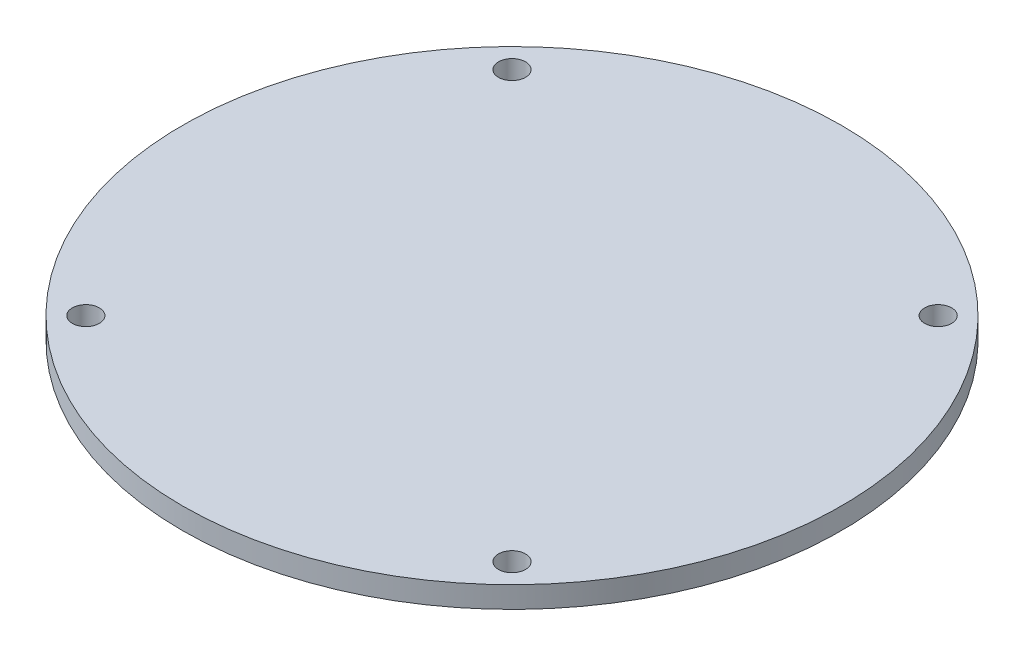
ISO-10303-21;
HEADER;
FILE_DESCRIPTION(('STEP AP214'),'2;1');
FILE_NAME('part.step','',(''),(''),'','','');
FILE_SCHEMA(('AUTOMOTIVE_DESIGN { 1 0 10303 214 1 1 1 1 }'));
ENDSEC;
DATA;
#1=APPLICATION_CONTEXT('core data for automotive mechanical design processes');
#2=APPLICATION_PROTOCOL_DEFINITION('international standard','automotive_design',2000,#1);
#3=PRODUCT_CONTEXT('',#1,'mechanical');
#4=PRODUCT('Part','Part','',(#3));
#5=PRODUCT_RELATED_PRODUCT_CATEGORY('part','',(#4));
#6=PRODUCT_DEFINITION_FORMATION('','',#4);
#7=PRODUCT_DEFINITION_CONTEXT('part definition',#1,'design');
#8=PRODUCT_DEFINITION('design','',#6,#7);
#9=PRODUCT_DEFINITION_SHAPE('','',#8);
#10=(LENGTH_UNIT() NAMED_UNIT(*) SI_UNIT(.MILLI.,.METRE.));
#11=(NAMED_UNIT(*) PLANE_ANGLE_UNIT() SI_UNIT($,.RADIAN.));
#12=(NAMED_UNIT(*) SI_UNIT($,.STERADIAN.) SOLID_ANGLE_UNIT());
#13=UNCERTAINTY_MEASURE_WITH_UNIT(LENGTH_MEASURE(1.E-05),#10,'distance_accuracy_value','');
#14=(GEOMETRIC_REPRESENTATION_CONTEXT(3) GLOBAL_UNCERTAINTY_ASSIGNED_CONTEXT((#13)) GLOBAL_UNIT_ASSIGNED_CONTEXT((#10,
#11,#12)) REPRESENTATION_CONTEXT('',''));
#15=CARTESIAN_POINT('',(0.,0.,0.));
#16=DIRECTION('',(0.,0.,1.));
#17=DIRECTION('',(1.,0.,0.));
#18=AXIS2_PLACEMENT_3D('',#15,#16,#17);
#19=CARTESIAN_POINT('',(16.1644610179254,1.6256,16.1644610179245));
#20=DIRECTION('',(0.,-1.,0.));
#21=DIRECTION('',(0.,0.,-1.));
#22=AXIS2_PLACEMENT_3D('',#19,#20,#21);
#23=CYLINDRICAL_SURFACE('',#22,1.02499999999977);
#24=CARTESIAN_POINT('',(16.1644610179254,1.6256,16.1644610179245));
#25=DIRECTION('',(0.,1.,0.));
#26=DIRECTION('',(0.,0.,1.));
#27=AXIS2_PLACEMENT_3D('',#24,#25,#26);
#28=CIRCLE('',#27,1.02499999999977);
#29=CARTESIAN_POINT('',(16.1644610179254,1.6256,17.1894610179242));
#30=VERTEX_POINT('',#29);
#31=EDGE_CURVE('E41',#30,#30,#28,.T.);
#32=ORIENTED_EDGE('',*,*,#31,.T.);
#33=EDGE_LOOP('',(#32));
#34=FACE_BOUND('',#33,.T.);
#35=CARTESIAN_POINT('',(16.1644610179254,0.,16.1644610179245));
#36=DIRECTION('',(0.,1.,0.));
#37=DIRECTION('',(0.,0.,1.));
#38=AXIS2_PLACEMENT_3D('',#35,#36,#37);
#39=CIRCLE('',#38,1.02499999999977);
#40=CARTESIAN_POINT('',(16.1644610179254,0.,17.1894610179242));
#41=VERTEX_POINT('',#40);
#42=EDGE_CURVE('E58',#41,#41,#39,.T.);
#43=ORIENTED_EDGE('',*,*,#42,.F.);
#44=EDGE_LOOP('',(#43));
#45=FACE_BOUND('',#44,.T.);
#46=ADVANCED_FACE('F33',(#34,#45),#23,.F.);
#47=CARTESIAN_POINT('',(-16.1644610179236,1.6256,16.1644610179254));
#48=DIRECTION('',(0.,-1.,0.));
#49=DIRECTION('',(0.,0.,-1.));
#50=AXIS2_PLACEMENT_3D('',#47,#48,#49);
#51=CYLINDRICAL_SURFACE('',#50,1.02500000000068);
#52=CARTESIAN_POINT('',(-16.1644610179236,1.6256,16.1644610179254));
#53=DIRECTION('',(0.,1.,0.));
#54=DIRECTION('',(0.,0.,1.));
#55=AXIS2_PLACEMENT_3D('',#52,#53,#54);
#56=CIRCLE('',#55,1.02500000000068);
#57=CARTESIAN_POINT('',(-16.1644610179236,1.6256,17.1894610179261));
#58=VERTEX_POINT('',#57);
#59=EDGE_CURVE('E46',#58,#58,#56,.T.);
#60=ORIENTED_EDGE('',*,*,#59,.T.);
#61=EDGE_LOOP('',(#60));
#62=FACE_BOUND('',#61,.T.);
#63=CARTESIAN_POINT('',(-16.1644610179236,0.,16.1644610179254));
#64=DIRECTION('',(0.,1.,0.));
#65=DIRECTION('',(0.,0.,1.));
#66=AXIS2_PLACEMENT_3D('',#63,#64,#65);
#67=CIRCLE('',#66,1.02500000000068);
#68=CARTESIAN_POINT('',(-16.1644610179236,0.,17.1894610179261));
#69=VERTEX_POINT('',#68);
#70=EDGE_CURVE('E56',#69,#69,#67,.T.);
#71=ORIENTED_EDGE('',*,*,#70,.F.);
#72=EDGE_LOOP('',(#71));
#73=FACE_BOUND('',#72,.T.);
#74=ADVANCED_FACE('F76',(#62,#73),#51,.F.);
#75=CARTESIAN_POINT('',(-16.1644610179245,1.6256,-16.1644610179236));
#76=DIRECTION('',(0.,-1.,0.));
#77=DIRECTION('',(0.,0.,-1.));
#78=AXIS2_PLACEMENT_3D('',#75,#76,#77);
#79=CYLINDRICAL_SURFACE('',#78,1.02500000000097);
#80=CARTESIAN_POINT('',(-16.1644610179245,1.6256,-16.1644610179236));
#81=DIRECTION('',(0.,1.,0.));
#82=DIRECTION('',(0.,0.,1.));
#83=AXIS2_PLACEMENT_3D('',#80,#81,#82);
#84=CIRCLE('',#83,1.02500000000097);
#85=CARTESIAN_POINT('',(-16.1644610179245,1.6256,-15.1394610179226));
#86=VERTEX_POINT('',#85);
#87=EDGE_CURVE('E67',#86,#86,#84,.T.);
#88=ORIENTED_EDGE('',*,*,#87,.T.);
#89=EDGE_LOOP('',(#88));
#90=FACE_BOUND('',#89,.T.);
#91=CARTESIAN_POINT('',(-16.1644610179245,0.,-16.1644610179236));
#92=DIRECTION('',(0.,1.,0.));
#93=DIRECTION('',(0.,0.,1.));
#94=AXIS2_PLACEMENT_3D('',#91,#92,#93);
#95=CIRCLE('',#94,1.02500000000097);
#96=CARTESIAN_POINT('',(-16.1644610179245,0.,-15.1394610179226));
#97=VERTEX_POINT('',#96);
#98=EDGE_CURVE('E53',#97,#97,#95,.T.);
#99=ORIENTED_EDGE('',*,*,#98,.F.);
#100=EDGE_LOOP('',(#99));
#101=FACE_BOUND('',#100,.T.);
#102=ADVANCED_FACE('F94',(#90,#101),#79,.F.);
#103=CARTESIAN_POINT('',(16.1644610179245,1.6256,-16.1644610179245));
#104=DIRECTION('',(0.,-1.,0.));
#105=DIRECTION('',(0.,0.,-1.));
#106=AXIS2_PLACEMENT_3D('',#103,#104,#105);
#107=CYLINDRICAL_SURFACE('',#106,1.025);
#108=CARTESIAN_POINT('',(16.1644610179245,1.6256,-16.1644610179245));
#109=DIRECTION('',(0.,1.,0.));
#110=DIRECTION('',(0.,0.,1.));
#111=AXIS2_PLACEMENT_3D('',#108,#109,#110);
#112=CIRCLE('',#111,1.025);
#113=CARTESIAN_POINT('',(16.1644610179245,1.6256,-15.1394610179245));
#114=VERTEX_POINT('',#113);
#115=EDGE_CURVE('E63',#114,#114,#112,.T.);
#116=ORIENTED_EDGE('',*,*,#115,.T.);
#117=EDGE_LOOP('',(#116));
#118=FACE_BOUND('',#117,.T.);
#119=CARTESIAN_POINT('',(16.1644610179245,0.,-16.1644610179245));
#120=DIRECTION('',(0.,1.,0.));
#121=DIRECTION('',(0.,0.,1.));
#122=AXIS2_PLACEMENT_3D('',#119,#120,#121);
#123=CIRCLE('',#122,1.025);
#124=CARTESIAN_POINT('',(16.1644610179245,0.,-15.1394610179245));
#125=VERTEX_POINT('',#124);
#126=EDGE_CURVE('E50',#125,#125,#123,.T.);
#127=ORIENTED_EDGE('',*,*,#126,.F.);
#128=EDGE_LOOP('',(#127));
#129=FACE_BOUND('',#128,.T.);
#130=ADVANCED_FACE('F35',(#118,#129),#107,.F.);
#131=CARTESIAN_POINT('',(0.,1.6256,0.));
#132=DIRECTION('',(0.,-1.,0.));
#133=DIRECTION('',(0.,0.,-1.));
#134=AXIS2_PLACEMENT_3D('',#131,#132,#133);
#135=CYLINDRICAL_SURFACE('',#134,25.);
#136=CARTESIAN_POINT('',(0.,1.6256,0.));
#137=DIRECTION('',(0.,1.,0.));
#138=DIRECTION('',(0.,0.,1.));
#139=AXIS2_PLACEMENT_3D('',#136,#137,#138);
#140=CIRCLE('',#139,25.);
#141=CARTESIAN_POINT('',(0.,1.6256,25.));
#142=VERTEX_POINT('',#141);
#143=EDGE_CURVE('E10',#142,#142,#140,.T.);
#144=ORIENTED_EDGE('',*,*,#143,.F.);
#145=EDGE_LOOP('',(#144));
#146=FACE_BOUND('',#145,.T.);
#147=CARTESIAN_POINT('',(0.,0.,0.));
#148=DIRECTION('',(0.,1.,0.));
#149=DIRECTION('',(0.,0.,1.));
#150=AXIS2_PLACEMENT_3D('',#147,#148,#149);
#151=CIRCLE('',#150,25.);
#152=CARTESIAN_POINT('',(0.,0.,25.));
#153=VERTEX_POINT('',#152);
#154=EDGE_CURVE('E37',#153,#153,#151,.T.);
#155=ORIENTED_EDGE('',*,*,#154,.T.);
#156=EDGE_LOOP('',(#155));
#157=FACE_BOUND('',#156,.T.);
#158=ADVANCED_FACE('F83',(#146,#157),#135,.T.);
#159=CARTESIAN_POINT('',(0.,1.6256,0.));
#160=DIRECTION('',(0.,1.,0.));
#161=DIRECTION('',(0.,0.,1.));
#162=AXIS2_PLACEMENT_3D('',#159,#160,#161);
#163=PLANE('',#162);
#164=ORIENTED_EDGE('',*,*,#115,.F.);
#165=EDGE_LOOP('',(#164));
#166=FACE_BOUND('',#165,.T.);
#167=ORIENTED_EDGE('',*,*,#87,.F.);
#168=EDGE_LOOP('',(#167));
#169=FACE_BOUND('',#168,.T.);
#170=ORIENTED_EDGE('',*,*,#59,.F.);
#171=EDGE_LOOP('',(#170));
#172=FACE_BOUND('',#171,.T.);
#173=ORIENTED_EDGE('',*,*,#31,.F.);
#174=EDGE_LOOP('',(#173));
#175=FACE_BOUND('',#174,.T.);
#176=ORIENTED_EDGE('',*,*,#143,.T.);
#177=EDGE_LOOP('',(#176));
#178=FACE_BOUND('',#177,.T.);
#179=ADVANCED_FACE('F79',(#166,#169,#172,#175,#178),#163,.T.);
#180=CARTESIAN_POINT('',(0.,0.,0.));
#181=DIRECTION('',(0.,1.,0.));
#182=DIRECTION('',(0.,0.,1.));
#183=AXIS2_PLACEMENT_3D('',#180,#181,#182);
#184=PLANE('',#183);
#185=ORIENTED_EDGE('',*,*,#126,.T.);
#186=EDGE_LOOP('',(#185));
#187=FACE_BOUND('',#186,.T.);
#188=ORIENTED_EDGE('',*,*,#98,.T.);
#189=EDGE_LOOP('',(#188));
#190=FACE_BOUND('',#189,.T.);
#191=ORIENTED_EDGE('',*,*,#70,.T.);
#192=EDGE_LOOP('',(#191));
#193=FACE_BOUND('',#192,.T.);
#194=ORIENTED_EDGE('',*,*,#42,.T.);
#195=EDGE_LOOP('',(#194));
#196=FACE_BOUND('',#195,.T.);
#197=ORIENTED_EDGE('',*,*,#154,.F.);
#198=EDGE_LOOP('',(#197));
#199=FACE_BOUND('',#198,.T.);
#200=ADVANCED_FACE('F82',(#187,#190,#193,#196,#199),#184,.F.);
#201=CLOSED_SHELL('',(#46,#74,#102,#130,#158,#179,#200));
#202=MANIFOLD_SOLID_BREP('B2',#201);
#203=ADVANCED_BREP_SHAPE_REPRESENTATION('',(#18,#202),#14);
#204=SHAPE_DEFINITION_REPRESENTATION(#9,#203);
ENDSEC;
END-ISO-10303-21;
